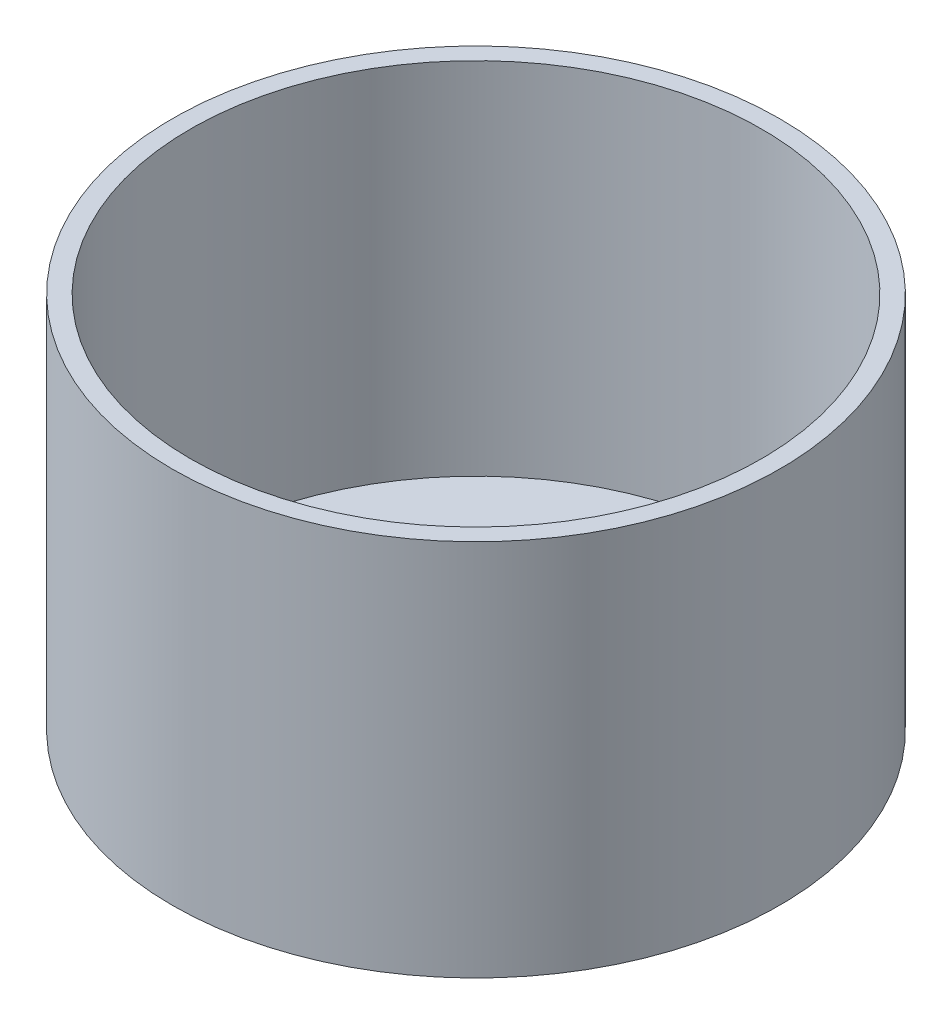
ISO-10303-21;
HEADER;
FILE_DESCRIPTION(('STEP AP214'),'2;1');
FILE_NAME('part.step','',(''),(''),'','','');
FILE_SCHEMA(('AUTOMOTIVE_DESIGN { 1 0 10303 214 1 1 1 1 }'));
ENDSEC;
DATA;
#1=APPLICATION_CONTEXT('core data for automotive mechanical design processes');
#2=APPLICATION_PROTOCOL_DEFINITION('international standard','automotive_design',2000,#1);
#3=PRODUCT_CONTEXT('',#1,'mechanical');
#4=PRODUCT('Part','Part','',(#3));
#5=PRODUCT_RELATED_PRODUCT_CATEGORY('part','',(#4));
#6=PRODUCT_DEFINITION_FORMATION('','',#4);
#7=PRODUCT_DEFINITION_CONTEXT('part definition',#1,'design');
#8=PRODUCT_DEFINITION('design','',#6,#7);
#9=PRODUCT_DEFINITION_SHAPE('','',#8);
#10=(LENGTH_UNIT() NAMED_UNIT(*) SI_UNIT(.MILLI.,.METRE.));
#11=(NAMED_UNIT(*) PLANE_ANGLE_UNIT() SI_UNIT($,.RADIAN.));
#12=(NAMED_UNIT(*) SI_UNIT($,.STERADIAN.) SOLID_ANGLE_UNIT());
#13=UNCERTAINTY_MEASURE_WITH_UNIT(LENGTH_MEASURE(1.E-05),#10,'distance_accuracy_value','');
#14=(GEOMETRIC_REPRESENTATION_CONTEXT(3) GLOBAL_UNCERTAINTY_ASSIGNED_CONTEXT((#13)) GLOBAL_UNIT_ASSIGNED_CONTEXT((#10,
#11,#12)) REPRESENTATION_CONTEXT('',''));
#15=CARTESIAN_POINT('',(0.,0.,0.));
#16=DIRECTION('',(0.,0.,1.));
#17=DIRECTION('',(1.,0.,0.));
#18=AXIS2_PLACEMENT_3D('',#15,#16,#17);
#19=CARTESIAN_POINT('',(0.,2.,0.));
#20=DIRECTION('',(0.,-1.,0.));
#21=DIRECTION('',(0.,0.,-1.));
#22=AXIS2_PLACEMENT_3D('',#19,#20,#21);
#23=CYLINDRICAL_SURFACE('',#22,33.75);
#24=CARTESIAN_POINT('',(0.,0.,0.));
#25=DIRECTION('',(0.,1.,0.));
#26=DIRECTION('',(0.,0.,1.));
#27=AXIS2_PLACEMENT_3D('',#24,#25,#26);
#28=CIRCLE('',#27,33.75);
#29=CARTESIAN_POINT('',(0.,0.,33.75));
#30=VERTEX_POINT('',#29);
#31=EDGE_CURVE('E46',#30,#30,#28,.T.);
#32=ORIENTED_EDGE('',*,*,#31,.T.);
#33=EDGE_LOOP('',(#32));
#34=FACE_BOUND('',#33,.T.);
#35=CARTESIAN_POINT('',(0.,42.,0.));
#36=DIRECTION('',(0.,1.,0.));
#37=DIRECTION('',(0.,0.,1.));
#38=AXIS2_PLACEMENT_3D('',#35,#36,#37);
#39=CIRCLE('',#38,33.75);
#40=CARTESIAN_POINT('',(0.,42.,33.75));
#41=VERTEX_POINT('',#40);
#42=EDGE_CURVE('E51',#41,#41,#39,.T.);
#43=ORIENTED_EDGE('',*,*,#42,.F.);
#44=EDGE_LOOP('',(#43));
#45=FACE_BOUND('',#44,.T.);
#46=ADVANCED_FACE('F39',(#34,#45),#23,.T.);
#47=CARTESIAN_POINT('',(0.,0.,0.));
#48=DIRECTION('',(0.,1.,0.));
#49=DIRECTION('',(0.,0.,1.));
#50=AXIS2_PLACEMENT_3D('',#47,#48,#49);
#51=PLANE('',#50);
#52=ORIENTED_EDGE('',*,*,#31,.F.);
#53=EDGE_LOOP('',(#52));
#54=FACE_BOUND('',#53,.T.);
#55=ADVANCED_FACE('F67',(#54),#51,.F.);
#56=CARTESIAN_POINT('',(0.,42.,0.));
#57=DIRECTION('',(0.,1.,0.));
#58=DIRECTION('',(0.,0.,1.));
#59=AXIS2_PLACEMENT_3D('',#56,#57,#58);
#60=PLANE('',#59);
#61=ORIENTED_EDGE('',*,*,#42,.T.);
#62=EDGE_LOOP('',(#61));
#63=FACE_BOUND('',#62,.T.);
#64=CARTESIAN_POINT('',(0.,42.,0.));
#65=DIRECTION('',(0.,1.,0.));
#66=DIRECTION('',(0.,0.,1.));
#67=AXIS2_PLACEMENT_3D('',#64,#65,#66);
#68=CIRCLE('',#67,31.75);
#69=CARTESIAN_POINT('',(0.,42.,31.75));
#70=VERTEX_POINT('',#69);
#71=EDGE_CURVE('E56',#70,#70,#68,.T.);
#72=ORIENTED_EDGE('',*,*,#71,.F.);
#73=EDGE_LOOP('',(#72));
#74=FACE_BOUND('',#73,.T.);
#75=ADVANCED_FACE('F65',(#63,#74),#60,.T.);
#76=CARTESIAN_POINT('',(0.,42.,0.));
#77=DIRECTION('',(0.,-1.,0.));
#78=DIRECTION('',(0.,0.,-1.));
#79=AXIS2_PLACEMENT_3D('',#76,#77,#78);
#80=CYLINDRICAL_SURFACE('',#79,31.75);
#81=ORIENTED_EDGE('',*,*,#71,.T.);
#82=EDGE_LOOP('',(#81));
#83=FACE_BOUND('',#82,.T.);
#84=CARTESIAN_POINT('',(0.,2.,0.));
#85=DIRECTION('',(0.,1.,0.));
#86=DIRECTION('',(0.,0.,1.));
#87=AXIS2_PLACEMENT_3D('',#84,#85,#86);
#88=CIRCLE('',#87,31.75);
#89=CARTESIAN_POINT('',(0.,2.,31.75));
#90=VERTEX_POINT('',#89);
#91=EDGE_CURVE('E10',#90,#90,#88,.F.);
#92=ORIENTED_EDGE('',*,*,#91,.T.);
#93=EDGE_LOOP('',(#92));
#94=FACE_BOUND('',#93,.T.);
#95=ADVANCED_FACE('F63',(#83,#94),#80,.F.);
#96=CARTESIAN_POINT('',(0.,2.,0.));
#97=DIRECTION('',(0.,1.,0.));
#98=DIRECTION('',(0.,0.,1.));
#99=AXIS2_PLACEMENT_3D('',#96,#97,#98);
#100=PLANE('',#99);
#101=ORIENTED_EDGE('',*,*,#91,.F.);
#102=EDGE_LOOP('',(#101));
#103=FACE_BOUND('',#102,.T.);
#104=ADVANCED_FACE('F74',(#103),#100,.T.);
#105=CLOSED_SHELL('',(#46,#55,#75,#95,#104));
#106=MANIFOLD_SOLID_BREP('B2',#105);
#107=ADVANCED_BREP_SHAPE_REPRESENTATION('',(#18,#106),#14);
#108=SHAPE_DEFINITION_REPRESENTATION(#9,#107);
ENDSEC;
END-ISO-10303-21;
